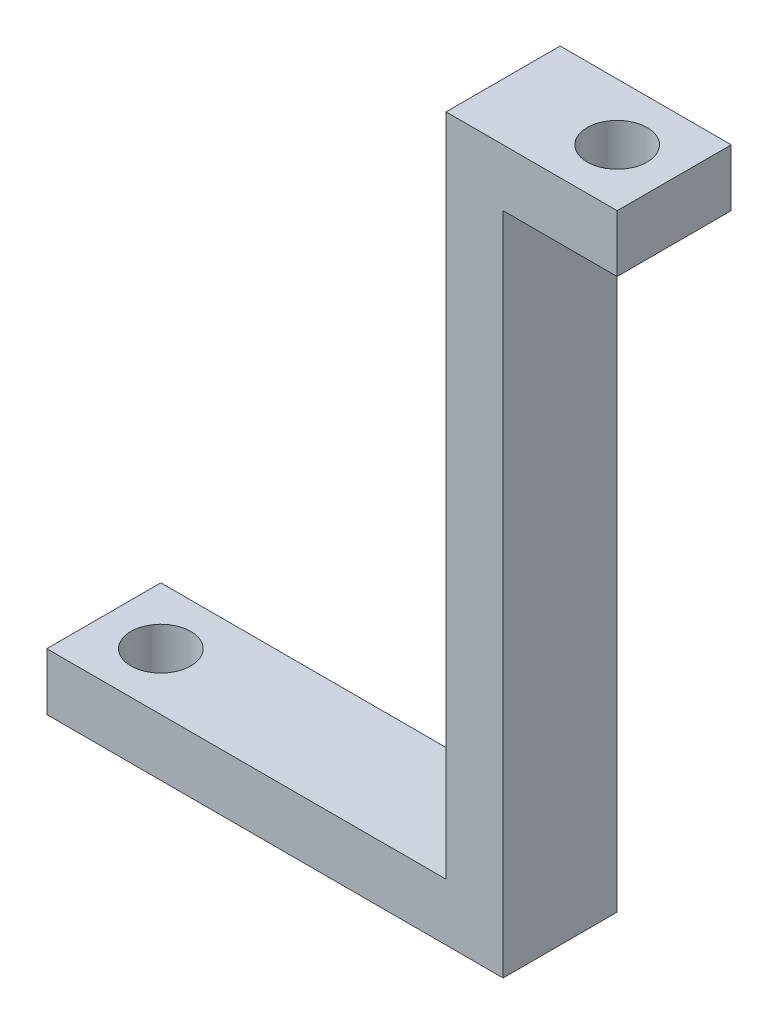
ISO-10303-21;
HEADER;
FILE_DESCRIPTION(('STEP AP214'),'2;1');
FILE_NAME('part.step','',(''),(''),'','','');
FILE_SCHEMA(('AUTOMOTIVE_DESIGN { 1 0 10303 214 1 1 1 1 }'));
ENDSEC;
DATA;
#1=APPLICATION_CONTEXT('core data for automotive mechanical design processes');
#2=APPLICATION_PROTOCOL_DEFINITION('international standard','automotive_design',2000,#1);
#3=PRODUCT_CONTEXT('',#1,'mechanical');
#4=PRODUCT('Part','Part','',(#3));
#5=PRODUCT_RELATED_PRODUCT_CATEGORY('part','',(#4));
#6=PRODUCT_DEFINITION_FORMATION('','',#4);
#7=PRODUCT_DEFINITION_CONTEXT('part definition',#1,'design');
#8=PRODUCT_DEFINITION('design','',#6,#7);
#9=PRODUCT_DEFINITION_SHAPE('','',#8);
#10=(LENGTH_UNIT() NAMED_UNIT(*) SI_UNIT(.MILLI.,.METRE.));
#11=(NAMED_UNIT(*) PLANE_ANGLE_UNIT() SI_UNIT($,.RADIAN.));
#12=(NAMED_UNIT(*) SI_UNIT($,.STERADIAN.) SOLID_ANGLE_UNIT());
#13=UNCERTAINTY_MEASURE_WITH_UNIT(LENGTH_MEASURE(1.E-05),#10,'distance_accuracy_value','');
#14=(GEOMETRIC_REPRESENTATION_CONTEXT(3) GLOBAL_UNCERTAINTY_ASSIGNED_CONTEXT((#13)) GLOBAL_UNIT_ASSIGNED_CONTEXT((#10,
#11,#12)) REPRESENTATION_CONTEXT('',''));
#15=CARTESIAN_POINT('',(0.,0.,0.));
#16=DIRECTION('',(0.,0.,1.));
#17=DIRECTION('',(1.,0.,0.));
#18=AXIS2_PLACEMENT_3D('',#15,#16,#17);
#19=CARTESIAN_POINT('',(0.,2.,0.));
#20=DIRECTION('',(0.,1.,0.));
#21=DIRECTION('',(0.,0.,1.));
#22=AXIS2_PLACEMENT_3D('',#19,#20,#21);
#23=PLANE('',#22);
#24=DIRECTION('',(0.,0.,-1.));
#25=VECTOR('',#24,1.);
#26=CARTESIAN_POINT('',(11.9999999999994,2.,-2.));
#27=LINE('',#26,#25);
#28=CARTESIAN_POINT('',(11.9999999999994,2.,2.));
#29=VERTEX_POINT('',#28);
#30=CARTESIAN_POINT('',(11.9999999999994,2.,-2.));
#31=VERTEX_POINT('',#30);
#32=EDGE_CURVE('E165',#29,#31,#27,.T.);
#33=ORIENTED_EDGE('',*,*,#32,.T.);
#34=DIRECTION('',(-1.,0.,0.));
#35=VECTOR('',#34,1.);
#36=CARTESIAN_POINT('',(-2.,2.,-2.));
#37=LINE('',#36,#35);
#38=CARTESIAN_POINT('',(-2.,2.,-2.));
#39=VERTEX_POINT('',#38);
#40=EDGE_CURVE('E168',#31,#39,#37,.T.);
#41=ORIENTED_EDGE('',*,*,#40,.T.);
#42=DIRECTION('',(0.,0.,1.));
#43=VECTOR('',#42,1.);
#44=CARTESIAN_POINT('',(-2.,2.,-2.));
#45=LINE('',#44,#43);
#46=CARTESIAN_POINT('',(-2.,2.,2.));
#47=VERTEX_POINT('',#46);
#48=EDGE_CURVE('E61',#39,#47,#45,.T.);
#49=ORIENTED_EDGE('',*,*,#48,.T.);
#50=DIRECTION('',(1.,0.,0.));
#51=VECTOR('',#50,1.);
#52=CARTESIAN_POINT('',(-2.,2.,2.));
#53=LINE('',#52,#51);
#54=EDGE_CURVE('E172',#47,#29,#53,.T.);
#55=ORIENTED_EDGE('',*,*,#54,.T.);
#56=EDGE_LOOP('',(#33,#41,#49,#55));
#57=FACE_BOUND('',#56,.T.);
#58=CARTESIAN_POINT('',(0.,2.,0.));
#59=DIRECTION('',(0.,1.,0.));
#60=DIRECTION('',(0.,0.,1.));
#61=AXIS2_PLACEMENT_3D('',#58,#59,#60);
#62=CIRCLE('',#61,1.05);
#63=CARTESIAN_POINT('',(0.,2.,1.05));
#64=VERTEX_POINT('',#63);
#65=EDGE_CURVE('E159',#64,#64,#62,.T.);
#66=ORIENTED_EDGE('',*,*,#65,.F.);
#67=EDGE_LOOP('',(#66));
#68=FACE_BOUND('',#67,.T.);
#69=ADVANCED_FACE('F37',(#57,#68),#23,.T.);
#70=CARTESIAN_POINT('',(0.,0.,0.));
#71=DIRECTION('',(0.,1.,0.));
#72=DIRECTION('',(0.,0.,1.));
#73=AXIS2_PLACEMENT_3D('',#70,#71,#72);
#74=PLANE('',#73);
#75=DIRECTION('',(-1.,0.,0.));
#76=VECTOR('',#75,1.);
#77=CARTESIAN_POINT('',(-2.,0.,-2.));
#78=LINE('',#77,#76);
#79=CARTESIAN_POINT('',(13.9999999999994,0.,-2.));
#80=VERTEX_POINT('',#79);
#81=CARTESIAN_POINT('',(-2.,0.,-2.));
#82=VERTEX_POINT('',#81);
#83=EDGE_CURVE('E162',#80,#82,#78,.T.);
#84=ORIENTED_EDGE('',*,*,#83,.F.);
#85=DIRECTION('',(0.,0.,-1.));
#86=VECTOR('',#85,1.);
#87=CARTESIAN_POINT('',(13.9999999999994,0.,2.));
#88=LINE('',#87,#86);
#89=CARTESIAN_POINT('',(13.9999999999994,0.,2.));
#90=VERTEX_POINT('',#89);
#91=EDGE_CURVE('E141',#90,#80,#88,.T.);
#92=ORIENTED_EDGE('',*,*,#91,.F.);
#93=DIRECTION('',(1.,0.,0.));
#94=VECTOR('',#93,1.);
#95=CARTESIAN_POINT('',(-2.,0.,2.));
#96=LINE('',#95,#94);
#97=CARTESIAN_POINT('',(-2.,0.,2.));
#98=VERTEX_POINT('',#97);
#99=EDGE_CURVE('E169',#98,#90,#96,.T.);
#100=ORIENTED_EDGE('',*,*,#99,.F.);
#101=DIRECTION('',(0.,0.,1.));
#102=VECTOR('',#101,1.);
#103=CARTESIAN_POINT('',(-2.,0.,-2.));
#104=LINE('',#103,#102);
#105=EDGE_CURVE('E74',#82,#98,#104,.T.);
#106=ORIENTED_EDGE('',*,*,#105,.F.);
#107=EDGE_LOOP('',(#84,#92,#100,#106));
#108=FACE_BOUND('',#107,.T.);
#109=CARTESIAN_POINT('',(0.,0.,0.));
#110=DIRECTION('',(0.,1.,0.));
#111=DIRECTION('',(0.,0.,1.));
#112=AXIS2_PLACEMENT_3D('',#109,#110,#111);
#113=CIRCLE('',#112,1.05);
#114=CARTESIAN_POINT('',(0.,0.,1.05));
#115=VERTEX_POINT('',#114);
#116=EDGE_CURVE('E158',#115,#115,#113,.T.);
#117=ORIENTED_EDGE('',*,*,#116,.T.);
#118=EDGE_LOOP('',(#117));
#119=FACE_BOUND('',#118,.T.);
#120=ADVANCED_FACE('F181',(#108,#119),#74,.F.);
#121=CARTESIAN_POINT('',(-2.,2.,-2.));
#122=DIRECTION('',(0.,0.,1.));
#123=DIRECTION('',(1.,0.,0.));
#124=AXIS2_PLACEMENT_3D('',#121,#122,#123);
#125=PLANE('',#124);
#126=ORIENTED_EDGE('',*,*,#83,.T.);
#127=DIRECTION('',(0.,-1.,0.));
#128=VECTOR('',#127,1.);
#129=CARTESIAN_POINT('',(-2.,2.,-2.));
#130=LINE('',#129,#128);
#131=EDGE_CURVE('E11',#39,#82,#130,.T.);
#132=ORIENTED_EDGE('',*,*,#131,.F.);
#133=ORIENTED_EDGE('',*,*,#40,.F.);
#134=DIRECTION('',(0.,-1.,0.));
#135=VECTOR('',#134,1.);
#136=CARTESIAN_POINT('',(11.9999999999994,29.7721359549996,-2.));
#137=LINE('',#136,#135);
#138=CARTESIAN_POINT('',(11.9999999999994,25.3,-2.));
#139=VERTEX_POINT('',#138);
#140=EDGE_CURVE('E81',#139,#31,#137,.T.);
#141=ORIENTED_EDGE('',*,*,#140,.F.);
#142=DIRECTION('',(-1.,0.,0.));
#143=VECTOR('',#142,1.);
#144=CARTESIAN_POINT('',(13.9999999999994,25.3,-2.));
#145=LINE('',#144,#143);
#146=CARTESIAN_POINT('',(17.9999999999994,25.3,-2.));
#147=VERTEX_POINT('',#146);
#148=EDGE_CURVE('E148',#147,#139,#145,.T.);
#149=ORIENTED_EDGE('',*,*,#148,.F.);
#150=DIRECTION('',(0.,1.,0.));
#151=VECTOR('',#150,1.);
#152=CARTESIAN_POINT('',(17.9999999999994,23.3,-2.));
#153=LINE('',#152,#151);
#154=CARTESIAN_POINT('',(17.9999999999994,23.3,-2.));
#155=VERTEX_POINT('',#154);
#156=EDGE_CURVE('E123',#155,#147,#153,.T.);
#157=ORIENTED_EDGE('',*,*,#156,.F.);
#158=DIRECTION('',(-1.,0.,0.));
#159=VECTOR('',#158,1.);
#160=CARTESIAN_POINT('',(13.9999999999994,23.3,-2.));
#161=LINE('',#160,#159);
#162=CARTESIAN_POINT('',(13.9999999999994,23.3,-2.));
#163=VERTEX_POINT('',#162);
#164=EDGE_CURVE('E124',#155,#163,#161,.T.);
#165=ORIENTED_EDGE('',*,*,#164,.T.);
#166=DIRECTION('',(0.,-1.,0.));
#167=VECTOR('',#166,1.);
#168=CARTESIAN_POINT('',(13.9999999999994,29.7721359549996,-2.));
#169=LINE('',#168,#167);
#170=EDGE_CURVE('E152',#163,#80,#169,.T.);
#171=ORIENTED_EDGE('',*,*,#170,.T.);
#172=EDGE_LOOP('',(#126,#132,#133,#141,#149,#157,#165,#171));
#173=FACE_BOUND('',#172,.T.);
#174=ADVANCED_FACE('F39',(#173),#125,.F.);
#175=CARTESIAN_POINT('',(-2.,2.,-2.));
#176=DIRECTION('',(1.,0.,0.));
#177=DIRECTION('',(0.,0.,-1.));
#178=AXIS2_PLACEMENT_3D('',#175,#176,#177);
#179=PLANE('',#178);
#180=ORIENTED_EDGE('',*,*,#105,.T.);
#181=DIRECTION('',(0.,-1.,0.));
#182=VECTOR('',#181,1.);
#183=CARTESIAN_POINT('',(-2.,2.,2.));
#184=LINE('',#183,#182);
#185=EDGE_CURVE('E45',#47,#98,#184,.T.);
#186=ORIENTED_EDGE('',*,*,#185,.F.);
#187=ORIENTED_EDGE('',*,*,#48,.F.);
#188=ORIENTED_EDGE('',*,*,#131,.T.);
#189=EDGE_LOOP('',(#180,#186,#187,#188));
#190=FACE_BOUND('',#189,.T.);
#191=ADVANCED_FACE('F194',(#190),#179,.F.);
#192=CARTESIAN_POINT('',(-2.,2.,2.));
#193=DIRECTION('',(0.,0.,-1.));
#194=DIRECTION('',(-1.,0.,0.));
#195=AXIS2_PLACEMENT_3D('',#192,#193,#194);
#196=PLANE('',#195);
#197=ORIENTED_EDGE('',*,*,#99,.T.);
#198=DIRECTION('',(0.,-1.,0.));
#199=VECTOR('',#198,1.);
#200=CARTESIAN_POINT('',(13.9999999999994,29.7721359549996,2.));
#201=LINE('',#200,#199);
#202=CARTESIAN_POINT('',(13.9999999999994,23.3,2.));
#203=VERTEX_POINT('',#202);
#204=EDGE_CURVE('E132',#203,#90,#201,.T.);
#205=ORIENTED_EDGE('',*,*,#204,.F.);
#206=DIRECTION('',(1.,0.,0.));
#207=VECTOR('',#206,1.);
#208=CARTESIAN_POINT('',(17.9999999999994,23.3,2.));
#209=LINE('',#208,#207);
#210=CARTESIAN_POINT('',(17.9999999999994,23.3,2.));
#211=VERTEX_POINT('',#210);
#212=EDGE_CURVE('E52',#203,#211,#209,.T.);
#213=ORIENTED_EDGE('',*,*,#212,.T.);
#214=DIRECTION('',(0.,1.,0.));
#215=VECTOR('',#214,1.);
#216=CARTESIAN_POINT('',(17.9999999999994,23.3,2.));
#217=LINE('',#216,#215);
#218=CARTESIAN_POINT('',(17.9999999999994,25.3,2.));
#219=VERTEX_POINT('',#218);
#220=EDGE_CURVE('E114',#211,#219,#217,.T.);
#221=ORIENTED_EDGE('',*,*,#220,.T.);
#222=DIRECTION('',(1.,0.,0.));
#223=VECTOR('',#222,1.);
#224=CARTESIAN_POINT('',(11.9999999999994,25.3,2.));
#225=LINE('',#224,#223);
#226=CARTESIAN_POINT('',(11.9999999999994,25.3,2.));
#227=VERTEX_POINT('',#226);
#228=EDGE_CURVE('E143',#227,#219,#225,.T.);
#229=ORIENTED_EDGE('',*,*,#228,.F.);
#230=DIRECTION('',(0.,-1.,0.));
#231=VECTOR('',#230,1.);
#232=CARTESIAN_POINT('',(11.9999999999994,29.7721359549996,2.));
#233=LINE('',#232,#231);
#234=EDGE_CURVE('E146',#227,#29,#233,.T.);
#235=ORIENTED_EDGE('',*,*,#234,.T.);
#236=ORIENTED_EDGE('',*,*,#54,.F.);
#237=ORIENTED_EDGE('',*,*,#185,.T.);
#238=EDGE_LOOP('',(#197,#205,#213,#221,#229,#235,#236,#237));
#239=FACE_BOUND('',#238,.T.);
#240=ADVANCED_FACE('F131',(#239),#196,.F.);
#241=CARTESIAN_POINT('',(0.,2.,0.));
#242=DIRECTION('',(0.,-1.,0.));
#243=DIRECTION('',(0.,0.,-1.));
#244=AXIS2_PLACEMENT_3D('',#241,#242,#243);
#245=CYLINDRICAL_SURFACE('',#244,1.05);
#246=ORIENTED_EDGE('',*,*,#65,.T.);
#247=EDGE_LOOP('',(#246));
#248=FACE_BOUND('',#247,.T.);
#249=ORIENTED_EDGE('',*,*,#116,.F.);
#250=EDGE_LOOP('',(#249));
#251=FACE_BOUND('',#250,.T.);
#252=ADVANCED_FACE('F200',(#248,#251),#245,.F.);
#253=CARTESIAN_POINT('',(11.9999999999994,29.7721359549996,-2.));
#254=DIRECTION('',(1.,0.,0.));
#255=DIRECTION('',(0.,0.,-1.));
#256=AXIS2_PLACEMENT_3D('',#253,#254,#255);
#257=PLANE('',#256);
#258=ORIENTED_EDGE('',*,*,#32,.F.);
#259=ORIENTED_EDGE('',*,*,#234,.F.);
#260=DIRECTION('',(0.,0.,1.));
#261=VECTOR('',#260,1.);
#262=CARTESIAN_POINT('',(11.9999999999994,25.3,-2.));
#263=LINE('',#262,#261);
#264=EDGE_CURVE('E145',#139,#227,#263,.T.);
#265=ORIENTED_EDGE('',*,*,#264,.F.);
#266=ORIENTED_EDGE('',*,*,#140,.T.);
#267=EDGE_LOOP('',(#258,#259,#265,#266));
#268=FACE_BOUND('',#267,.T.);
#269=ADVANCED_FACE('F191',(#268),#257,.F.);
#270=CARTESIAN_POINT('',(13.9999999999994,29.7721359549996,2.));
#271=DIRECTION('',(-1.,0.,0.));
#272=DIRECTION('',(0.,0.,1.));
#273=AXIS2_PLACEMENT_3D('',#270,#271,#272);
#274=PLANE('',#273);
#275=ORIENTED_EDGE('',*,*,#170,.F.);
#276=DIRECTION('',(0.,0.,1.));
#277=VECTOR('',#276,1.);
#278=CARTESIAN_POINT('',(13.9999999999994,23.3,-2.));
#279=LINE('',#278,#277);
#280=EDGE_CURVE('E133',#163,#203,#279,.T.);
#281=ORIENTED_EDGE('',*,*,#280,.T.);
#282=ORIENTED_EDGE('',*,*,#204,.T.);
#283=ORIENTED_EDGE('',*,*,#91,.T.);
#284=EDGE_LOOP('',(#275,#281,#282,#283));
#285=FACE_BOUND('',#284,.T.);
#286=ADVANCED_FACE('F185',(#285),#274,.F.);
#287=CARTESIAN_POINT('',(1.74339709335669E-13,25.3,8.67500000000054));
#288=DIRECTION('',(0.,1.,0.));
#289=DIRECTION('',(-0.821516021410347,0.,-0.570185431737882));
#290=AXIS2_PLACEMENT_3D('',#287,#288,#289);
#291=PLANE('',#290);
#292=ORIENTED_EDGE('',*,*,#264,.T.);
#293=ORIENTED_EDGE('',*,*,#228,.T.);
#294=DIRECTION('',(0.,0.,-1.));
#295=VECTOR('',#294,1.);
#296=CARTESIAN_POINT('',(17.9999999999994,25.3,-2.));
#297=LINE('',#296,#295);
#298=EDGE_CURVE('E120',#219,#147,#297,.T.);
#299=ORIENTED_EDGE('',*,*,#298,.T.);
#300=ORIENTED_EDGE('',*,*,#148,.T.);
#301=EDGE_LOOP('',(#292,#293,#299,#300));
#302=FACE_BOUND('',#301,.T.);
#303=CARTESIAN_POINT('',(15.9999999999994,25.3,0.));
#304=DIRECTION('',(0.,1.,0.));
#305=DIRECTION('',(0.,0.,1.));
#306=AXIS2_PLACEMENT_3D('',#303,#304,#305);
#307=CIRCLE('',#306,1.05);
#308=CARTESIAN_POINT('',(15.9999999999994,25.3,1.05));
#309=VERTEX_POINT('',#308);
#310=EDGE_CURVE('E233',#309,#309,#307,.T.);
#311=ORIENTED_EDGE('',*,*,#310,.F.);
#312=EDGE_LOOP('',(#311));
#313=FACE_BOUND('',#312,.T.);
#314=ADVANCED_FACE('F188',(#302,#313),#291,.T.);
#315=CARTESIAN_POINT('',(17.9999999999994,23.3,-2.));
#316=DIRECTION('',(1.,0.,0.));
#317=DIRECTION('',(0.,0.,-1.));
#318=AXIS2_PLACEMENT_3D('',#315,#316,#317);
#319=PLANE('',#318);
#320=ORIENTED_EDGE('',*,*,#298,.F.);
#321=ORIENTED_EDGE('',*,*,#220,.F.);
#322=DIRECTION('',(0.,0.,-1.));
#323=VECTOR('',#322,1.);
#324=CARTESIAN_POINT('',(17.9999999999994,23.3,-2.));
#325=LINE('',#324,#323);
#326=EDGE_CURVE('E117',#211,#155,#325,.T.);
#327=ORIENTED_EDGE('',*,*,#326,.T.);
#328=ORIENTED_EDGE('',*,*,#156,.T.);
#329=EDGE_LOOP('',(#320,#321,#327,#328));
#330=FACE_BOUND('',#329,.T.);
#331=ADVANCED_FACE('F115',(#330),#319,.T.);
#332=CARTESIAN_POINT('',(0.,23.3,0.));
#333=DIRECTION('',(0.,-1.,0.));
#334=DIRECTION('',(0.,0.,-1.));
#335=AXIS2_PLACEMENT_3D('',#332,#333,#334);
#336=PLANE('',#335);
#337=CARTESIAN_POINT('',(15.9999999999994,23.3,0.));
#338=DIRECTION('',(0.,1.,0.));
#339=DIRECTION('',(0.,0.,1.));
#340=AXIS2_PLACEMENT_3D('',#337,#338,#339);
#341=CIRCLE('',#340,1.05);
#342=CARTESIAN_POINT('',(15.9999999999994,23.3,1.05));
#343=VERTEX_POINT('',#342);
#344=EDGE_CURVE('E140',#343,#343,#341,.T.);
#345=ORIENTED_EDGE('',*,*,#344,.T.);
#346=EDGE_LOOP('',(#345));
#347=FACE_BOUND('',#346,.T.);
#348=ORIENTED_EDGE('',*,*,#280,.F.);
#349=ORIENTED_EDGE('',*,*,#164,.F.);
#350=ORIENTED_EDGE('',*,*,#326,.F.);
#351=ORIENTED_EDGE('',*,*,#212,.F.);
#352=EDGE_LOOP('',(#348,#349,#350,#351));
#353=FACE_BOUND('',#352,.T.);
#354=ADVANCED_FACE('F126',(#347,#353),#336,.T.);
#355=CARTESIAN_POINT('',(15.9999999999994,23.3,0.));
#356=DIRECTION('',(0.,1.,0.));
#357=DIRECTION('',(0.,0.,1.));
#358=AXIS2_PLACEMENT_3D('',#355,#356,#357);
#359=CYLINDRICAL_SURFACE('',#358,1.05);
#360=ORIENTED_EDGE('',*,*,#344,.F.);
#361=EDGE_LOOP('',(#360));
#362=FACE_BOUND('',#361,.T.);
#363=ORIENTED_EDGE('',*,*,#310,.T.);
#364=EDGE_LOOP('',(#363));
#365=FACE_BOUND('',#364,.T.);
#366=ADVANCED_FACE('F222',(#362,#365),#359,.F.);
#367=CLOSED_SHELL('',(#69,#120,#174,#191,#240,#252,#269,#286,#314,#331,#354,#366));
#368=MANIFOLD_SOLID_BREP('B2',#367);
#369=ADVANCED_BREP_SHAPE_REPRESENTATION('',(#18,#368),#14);
#370=SHAPE_DEFINITION_REPRESENTATION(#9,#369);
ENDSEC;
END-ISO-10303-21;
